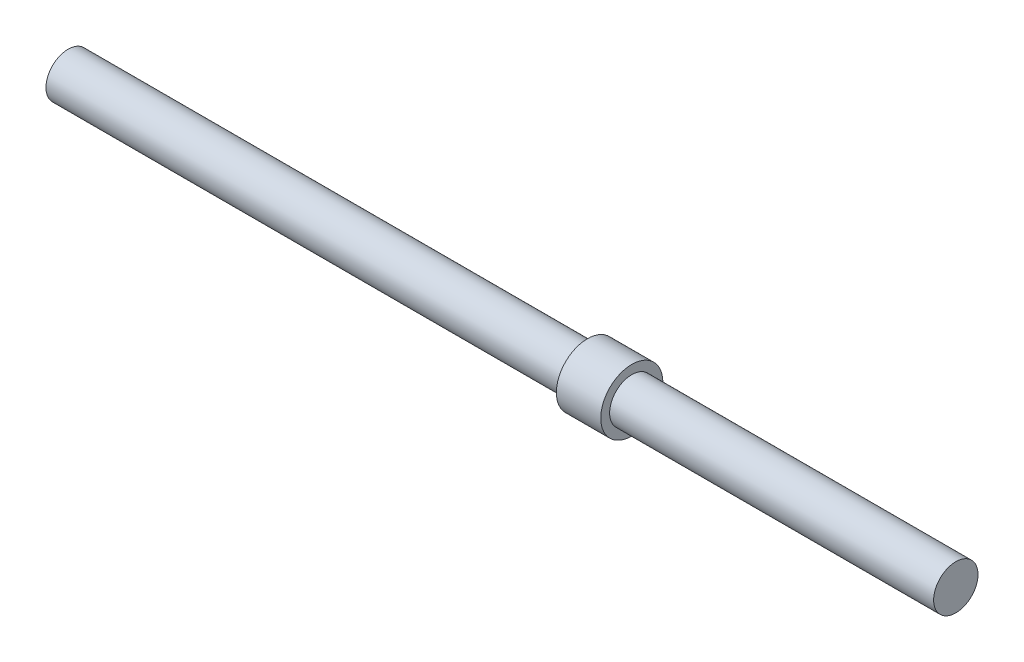
ISO-10303-21;
HEADER;
FILE_DESCRIPTION(('STEP AP214'),'2;1');
FILE_NAME('part.step','',(''),(''),'','','');
FILE_SCHEMA(('AUTOMOTIVE_DESIGN { 1 0 10303 214 1 1 1 1 }'));
ENDSEC;
DATA;
#1=APPLICATION_CONTEXT('core data for automotive mechanical design processes');
#2=APPLICATION_PROTOCOL_DEFINITION('international standard','automotive_design',2000,#1);
#3=PRODUCT_CONTEXT('',#1,'mechanical');
#4=PRODUCT('Part','Part','',(#3));
#5=PRODUCT_RELATED_PRODUCT_CATEGORY('part','',(#4));
#6=PRODUCT_DEFINITION_FORMATION('','',#4);
#7=PRODUCT_DEFINITION_CONTEXT('part definition',#1,'design');
#8=PRODUCT_DEFINITION('design','',#6,#7);
#9=PRODUCT_DEFINITION_SHAPE('','',#8);
#10=(LENGTH_UNIT() NAMED_UNIT(*) SI_UNIT(.MILLI.,.METRE.));
#11=(NAMED_UNIT(*) PLANE_ANGLE_UNIT() SI_UNIT($,.RADIAN.));
#12=(NAMED_UNIT(*) SI_UNIT($,.STERADIAN.) SOLID_ANGLE_UNIT());
#13=UNCERTAINTY_MEASURE_WITH_UNIT(LENGTH_MEASURE(1.E-05),#10,'distance_accuracy_value','');
#14=(GEOMETRIC_REPRESENTATION_CONTEXT(3) GLOBAL_UNCERTAINTY_ASSIGNED_CONTEXT((#13)) GLOBAL_UNIT_ASSIGNED_CONTEXT((#10,
#11,#12)) REPRESENTATION_CONTEXT('',''));
#15=CARTESIAN_POINT('',(0.,0.,0.));
#16=DIRECTION('',(0.,0.,1.));
#17=DIRECTION('',(1.,0.,0.));
#18=AXIS2_PLACEMENT_3D('',#15,#16,#17);
#19=CARTESIAN_POINT('',(100.,0.,0.));
#20=DIRECTION('',(-1.,0.,0.));
#21=DIRECTION('',(0.,0.,1.));
#22=AXIS2_PLACEMENT_3D('',#19,#20,#21);
#23=CYLINDRICAL_SURFACE('',#22,5.);
#24=CARTESIAN_POINT('',(27.,0.,0.));
#25=DIRECTION('',(1.,0.,0.));
#26=DIRECTION('',(0.,0.,-1.));
#27=AXIS2_PLACEMENT_3D('',#24,#25,#26);
#28=CIRCLE('',#27,5.);
#29=CARTESIAN_POINT('',(27.,0.,-5.));
#30=VERTEX_POINT('',#29);
#31=EDGE_CURVE('E37',#30,#30,#28,.T.);
#32=ORIENTED_EDGE('',*,*,#31,.T.);
#33=EDGE_LOOP('',(#32));
#34=FACE_BOUND('',#33,.T.);
#35=CARTESIAN_POINT('',(100.,0.,0.));
#36=DIRECTION('',(1.,0.,0.));
#37=DIRECTION('',(0.,0.,-1.));
#38=AXIS2_PLACEMENT_3D('',#35,#36,#37);
#39=CIRCLE('',#38,5.);
#40=CARTESIAN_POINT('',(100.,0.,-5.));
#41=VERTEX_POINT('',#40);
#42=EDGE_CURVE('E41',#41,#41,#39,.T.);
#43=ORIENTED_EDGE('',*,*,#42,.F.);
#44=EDGE_LOOP('',(#43));
#45=FACE_BOUND('',#44,.T.);
#46=ADVANCED_FACE('F34',(#34,#45),#23,.T.);
#47=CARTESIAN_POINT('',(100.,0.,0.));
#48=DIRECTION('',(1.,0.,0.));
#49=DIRECTION('',(0.,0.,-1.));
#50=AXIS2_PLACEMENT_3D('',#47,#48,#49);
#51=PLANE('',#50);
#52=ORIENTED_EDGE('',*,*,#42,.T.);
#53=EDGE_LOOP('',(#52));
#54=FACE_BOUND('',#53,.T.);
#55=ADVANCED_FACE('F73',(#54),#51,.T.);
#56=CARTESIAN_POINT('',(27.,0.,0.));
#57=DIRECTION('',(-1.,0.,0.));
#58=DIRECTION('',(0.,0.,1.));
#59=AXIS2_PLACEMENT_3D('',#56,#57,#58);
#60=CYLINDRICAL_SURFACE('',#59,7.);
#61=CARTESIAN_POINT('',(27.,0.,0.));
#62=DIRECTION('',(1.,0.,0.));
#63=DIRECTION('',(0.,0.,-1.));
#64=AXIS2_PLACEMENT_3D('',#61,#62,#63);
#65=CIRCLE('',#64,7.);
#66=CARTESIAN_POINT('',(27.,0.,-7.));
#67=VERTEX_POINT('',#66);
#68=EDGE_CURVE('E53',#67,#67,#65,.T.);
#69=ORIENTED_EDGE('',*,*,#68,.F.);
#70=EDGE_LOOP('',(#69));
#71=FACE_BOUND('',#70,.T.);
#72=CARTESIAN_POINT('',(17.,0.,0.));
#73=DIRECTION('',(1.,0.,0.));
#74=DIRECTION('',(0.,0.,-1.));
#75=AXIS2_PLACEMENT_3D('',#72,#73,#74);
#76=CIRCLE('',#75,7.);
#77=CARTESIAN_POINT('',(17.,0.,-7.));
#78=VERTEX_POINT('',#77);
#79=EDGE_CURVE('E50',#78,#78,#76,.T.);
#80=ORIENTED_EDGE('',*,*,#79,.T.);
#81=EDGE_LOOP('',(#80));
#82=FACE_BOUND('',#81,.T.);
#83=ADVANCED_FACE('F65',(#71,#82),#60,.T.);
#84=CARTESIAN_POINT('',(27.,0.,0.));
#85=DIRECTION('',(1.,0.,0.));
#86=DIRECTION('',(0.,0.,-1.));
#87=AXIS2_PLACEMENT_3D('',#84,#85,#86);
#88=PLANE('',#87);
#89=ORIENTED_EDGE('',*,*,#31,.F.);
#90=EDGE_LOOP('',(#89));
#91=FACE_BOUND('',#90,.T.);
#92=ORIENTED_EDGE('',*,*,#68,.T.);
#93=EDGE_LOOP('',(#92));
#94=FACE_BOUND('',#93,.T.);
#95=ADVANCED_FACE('F62',(#91,#94),#88,.T.);
#96=CARTESIAN_POINT('',(17.,0.,0.));
#97=DIRECTION('',(1.,0.,0.));
#98=DIRECTION('',(0.,0.,-1.));
#99=AXIS2_PLACEMENT_3D('',#96,#97,#98);
#100=PLANE('',#99);
#101=CARTESIAN_POINT('',(17.,0.,0.));
#102=DIRECTION('',(1.,0.,0.));
#103=DIRECTION('',(0.,0.,-1.));
#104=AXIS2_PLACEMENT_3D('',#101,#102,#103);
#105=CIRCLE('',#104,5.);
#106=CARTESIAN_POINT('',(17.,0.,-5.));
#107=VERTEX_POINT('',#106);
#108=EDGE_CURVE('E10',#107,#107,#105,.T.);
#109=ORIENTED_EDGE('',*,*,#108,.T.);
#110=EDGE_LOOP('',(#109));
#111=FACE_BOUND('',#110,.T.);
#112=ORIENTED_EDGE('',*,*,#79,.F.);
#113=EDGE_LOOP('',(#112));
#114=FACE_BOUND('',#113,.T.);
#115=ADVANCED_FACE('F64',(#111,#114),#100,.F.);
#116=CARTESIAN_POINT('',(-100.,0.,0.));
#117=DIRECTION('',(1.,0.,0.));
#118=DIRECTION('',(0.,0.,-1.));
#119=AXIS2_PLACEMENT_3D('',#116,#117,#118);
#120=PLANE('',#119);
#121=CARTESIAN_POINT('',(-100.,0.,0.));
#122=DIRECTION('',(1.,0.,0.));
#123=DIRECTION('',(0.,0.,-1.));
#124=AXIS2_PLACEMENT_3D('',#121,#122,#123);
#125=CIRCLE('',#124,5.);
#126=CARTESIAN_POINT('',(-100.,0.,-5.));
#127=VERTEX_POINT('',#126);
#128=EDGE_CURVE('E45',#127,#127,#125,.T.);
#129=ORIENTED_EDGE('',*,*,#128,.F.);
#130=EDGE_LOOP('',(#129));
#131=FACE_BOUND('',#130,.T.);
#132=ADVANCED_FACE('F71',(#131),#120,.F.);
#133=ORIENTED_EDGE('',*,*,#128,.T.);
#134=EDGE_LOOP('',(#133));
#135=FACE_BOUND('',#134,.T.);
#136=ORIENTED_EDGE('',*,*,#108,.F.);
#137=EDGE_LOOP('',(#136));
#138=FACE_BOUND('',#137,.T.);
#139=ADVANCED_FACE('F77',(#135,#138),#23,.T.);
#140=CLOSED_SHELL('',(#46,#55,#83,#95,#115,#132,#139));
#141=MANIFOLD_SOLID_BREP('B2',#140);
#142=ADVANCED_BREP_SHAPE_REPRESENTATION('',(#18,#141),#14);
#143=SHAPE_DEFINITION_REPRESENTATION(#9,#142);
ENDSEC;
END-ISO-10303-21;
